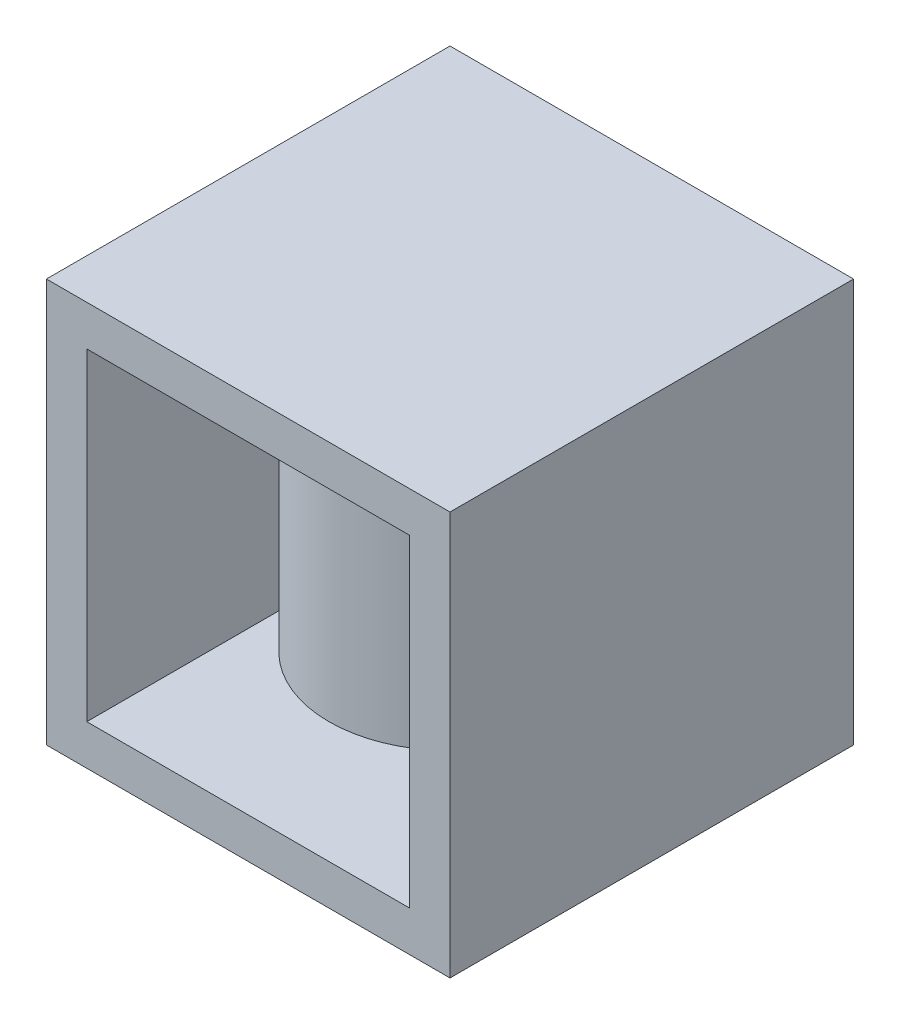
ISO-10303-21;
HEADER;
FILE_DESCRIPTION(('STEP AP214'),'2;1');
FILE_NAME('part.step','',(''),(''),'','','');
FILE_SCHEMA(('AUTOMOTIVE_DESIGN { 1 0 10303 214 1 1 1 1 }'));
ENDSEC;
DATA;
#1=APPLICATION_CONTEXT('core data for automotive mechanical design processes');
#2=APPLICATION_PROTOCOL_DEFINITION('international standard','automotive_design',2000,#1);
#3=PRODUCT_CONTEXT('',#1,'mechanical');
#4=PRODUCT('Part','Part','',(#3));
#5=PRODUCT_RELATED_PRODUCT_CATEGORY('part','',(#4));
#6=PRODUCT_DEFINITION_FORMATION('','',#4);
#7=PRODUCT_DEFINITION_CONTEXT('part definition',#1,'design');
#8=PRODUCT_DEFINITION('design','',#6,#7);
#9=PRODUCT_DEFINITION_SHAPE('','',#8);
#10=(LENGTH_UNIT() NAMED_UNIT(*) SI_UNIT(.MILLI.,.METRE.));
#11=(NAMED_UNIT(*) PLANE_ANGLE_UNIT() SI_UNIT($,.RADIAN.));
#12=(NAMED_UNIT(*) SI_UNIT($,.STERADIAN.) SOLID_ANGLE_UNIT());
#13=UNCERTAINTY_MEASURE_WITH_UNIT(LENGTH_MEASURE(1.E-05),#10,'distance_accuracy_value','');
#14=(GEOMETRIC_REPRESENTATION_CONTEXT(3) GLOBAL_UNCERTAINTY_ASSIGNED_CONTEXT((#13)) GLOBAL_UNIT_ASSIGNED_CONTEXT((#10,
#11,#12)) REPRESENTATION_CONTEXT('',''));
#15=CARTESIAN_POINT('',(0.,0.,0.));
#16=DIRECTION('',(0.,0.,1.));
#17=DIRECTION('',(1.,0.,0.));
#18=AXIS2_PLACEMENT_3D('',#15,#16,#17);
#19=CARTESIAN_POINT('',(0.,900.,1000.));
#20=DIRECTION('',(0.,1.,0.));
#21=DIRECTION('',(0.,0.,1.));
#22=AXIS2_PLACEMENT_3D('',#19,#20,#21);
#23=PLANE('',#22);
#24=CARTESIAN_POINT('',(500.,900.,500.));
#25=DIRECTION('',(0.,1.,0.));
#26=DIRECTION('',(0.,0.,1.));
#27=AXIS2_PLACEMENT_3D('',#24,#25,#26);
#28=CIRCLE('',#27,300.);
#29=CARTESIAN_POINT('',(500.,900.,800.));
#30=VERTEX_POINT('',#29);
#31=EDGE_CURVE('E11',#30,#30,#28,.F.);
#32=ORIENTED_EDGE('',*,*,#31,.F.);
#33=EDGE_LOOP('',(#32));
#34=FACE_BOUND('',#33,.T.);
#35=DIRECTION('',(1.,0.,0.));
#36=VECTOR('',#35,1.);
#37=CARTESIAN_POINT('',(0.,900.,0.));
#38=LINE('',#37,#36);
#39=CARTESIAN_POINT('',(100.,900.,0.));
#40=VERTEX_POINT('',#39);
#41=CARTESIAN_POINT('',(900.,900.,0.));
#42=VERTEX_POINT('',#41);
#43=EDGE_CURVE('E145',#40,#42,#38,.T.);
#44=ORIENTED_EDGE('',*,*,#43,.T.);
#45=DIRECTION('',(0.,0.,-1.));
#46=VECTOR('',#45,1.);
#47=CARTESIAN_POINT('',(900.,900.,1000.));
#48=LINE('',#47,#46);
#49=CARTESIAN_POINT('',(900.,900.,1000.));
#50=VERTEX_POINT('',#49);
#51=EDGE_CURVE('E44',#50,#42,#48,.T.);
#52=ORIENTED_EDGE('',*,*,#51,.F.);
#53=DIRECTION('',(1.,0.,0.));
#54=VECTOR('',#53,1.);
#55=CARTESIAN_POINT('',(0.,900.,1000.));
#56=LINE('',#55,#54);
#57=CARTESIAN_POINT('',(100.,900.,1000.));
#58=VERTEX_POINT('',#57);
#59=EDGE_CURVE('E113',#58,#50,#56,.T.);
#60=ORIENTED_EDGE('',*,*,#59,.F.);
#61=DIRECTION('',(0.,0.,-1.));
#62=VECTOR('',#61,1.);
#63=CARTESIAN_POINT('',(100.,900.,1000.));
#64=LINE('',#63,#62);
#65=EDGE_CURVE('E52',#58,#40,#64,.T.);
#66=ORIENTED_EDGE('',*,*,#65,.T.);
#67=EDGE_LOOP('',(#44,#52,#60,#66));
#68=FACE_BOUND('',#67,.T.);
#69=ADVANCED_FACE('F35',(#34,#68),#23,.F.);
#70=CARTESIAN_POINT('',(900.,-1.2490009027033E-13,1000.));
#71=DIRECTION('',(1.,0.,0.));
#72=DIRECTION('',(0.,1.,0.));
#73=AXIS2_PLACEMENT_3D('',#70,#71,#72);
#74=PLANE('',#73);
#75=DIRECTION('',(0.,-1.,0.));
#76=VECTOR('',#75,1.);
#77=CARTESIAN_POINT('',(900.,-1.2490009027033E-13,0.));
#78=LINE('',#77,#76);
#79=CARTESIAN_POINT('',(900.,100.,0.));
#80=VERTEX_POINT('',#79);
#81=EDGE_CURVE('E121',#42,#80,#78,.T.);
#82=ORIENTED_EDGE('',*,*,#81,.T.);
#83=DIRECTION('',(0.,0.,-1.));
#84=VECTOR('',#83,1.);
#85=CARTESIAN_POINT('',(900.,100.,1000.));
#86=LINE('',#85,#84);
#87=CARTESIAN_POINT('',(900.,100.,1000.));
#88=VERTEX_POINT('',#87);
#89=EDGE_CURVE('E119',#88,#80,#86,.T.);
#90=ORIENTED_EDGE('',*,*,#89,.F.);
#91=DIRECTION('',(0.,-1.,0.));
#92=VECTOR('',#91,1.);
#93=CARTESIAN_POINT('',(900.,-1.2490009027033E-13,1000.));
#94=LINE('',#93,#92);
#95=EDGE_CURVE('E107',#50,#88,#94,.T.);
#96=ORIENTED_EDGE('',*,*,#95,.F.);
#97=ORIENTED_EDGE('',*,*,#51,.T.);
#98=EDGE_LOOP('',(#82,#90,#96,#97));
#99=FACE_BOUND('',#98,.T.);
#100=ADVANCED_FACE('F120',(#99),#74,.F.);
#101=CARTESIAN_POINT('',(0.,100.,1000.));
#102=DIRECTION('',(0.,1.,0.));
#103=DIRECTION('',(0.,0.,1.));
#104=AXIS2_PLACEMENT_3D('',#101,#102,#103);
#105=PLANE('',#104);
#106=DIRECTION('',(1.,0.,0.));
#107=VECTOR('',#106,1.);
#108=CARTESIAN_POINT('',(0.,100.,0.));
#109=LINE('',#108,#107);
#110=CARTESIAN_POINT('',(100.,100.,0.));
#111=VERTEX_POINT('',#110);
#112=EDGE_CURVE('E148',#111,#80,#109,.T.);
#113=ORIENTED_EDGE('',*,*,#112,.F.);
#114=DIRECTION('',(0.,0.,-1.));
#115=VECTOR('',#114,1.);
#116=CARTESIAN_POINT('',(100.,100.,1000.));
#117=LINE('',#116,#115);
#118=CARTESIAN_POINT('',(100.,100.,1000.));
#119=VERTEX_POINT('',#118);
#120=EDGE_CURVE('E78',#119,#111,#117,.T.);
#121=ORIENTED_EDGE('',*,*,#120,.F.);
#122=DIRECTION('',(1.,0.,0.));
#123=VECTOR('',#122,1.);
#124=CARTESIAN_POINT('',(0.,100.,1000.));
#125=LINE('',#124,#123);
#126=EDGE_CURVE('E112',#119,#88,#125,.T.);
#127=ORIENTED_EDGE('',*,*,#126,.T.);
#128=ORIENTED_EDGE('',*,*,#89,.T.);
#129=EDGE_LOOP('',(#113,#121,#127,#128));
#130=FACE_BOUND('',#129,.T.);
#131=ADVANCED_FACE('F125',(#130),#105,.T.);
#132=CARTESIAN_POINT('',(0.,0.,1000.));
#133=DIRECTION('',(0.,1.,0.));
#134=DIRECTION('',(0.,0.,1.));
#135=AXIS2_PLACEMENT_3D('',#132,#133,#134);
#136=PLANE('',#135);
#137=DIRECTION('',(1.,0.,0.));
#138=VECTOR('',#137,1.);
#139=CARTESIAN_POINT('',(0.,0.,0.));
#140=LINE('',#139,#138);
#141=CARTESIAN_POINT('',(0.,0.,0.));
#142=VERTEX_POINT('',#141);
#143=CARTESIAN_POINT('',(1000.,0.,0.));
#144=VERTEX_POINT('',#143);
#145=EDGE_CURVE('E132',#142,#144,#140,.T.);
#146=ORIENTED_EDGE('',*,*,#145,.T.);
#147=DIRECTION('',(0.,0.,-1.));
#148=VECTOR('',#147,1.);
#149=CARTESIAN_POINT('',(1000.,0.,1000.));
#150=LINE('',#149,#148);
#151=CARTESIAN_POINT('',(1000.,0.,1000.));
#152=VERTEX_POINT('',#151);
#153=EDGE_CURVE('E155',#152,#144,#150,.T.);
#154=ORIENTED_EDGE('',*,*,#153,.F.);
#155=DIRECTION('',(1.,0.,0.));
#156=VECTOR('',#155,1.);
#157=CARTESIAN_POINT('',(0.,0.,1000.));
#158=LINE('',#157,#156);
#159=CARTESIAN_POINT('',(0.,0.,1000.));
#160=VERTEX_POINT('',#159);
#161=EDGE_CURVE('E153',#160,#152,#158,.T.);
#162=ORIENTED_EDGE('',*,*,#161,.F.);
#163=DIRECTION('',(0.,0.,-1.));
#164=VECTOR('',#163,1.);
#165=CARTESIAN_POINT('',(0.,0.,1000.));
#166=LINE('',#165,#164);
#167=EDGE_CURVE('E128',#160,#142,#166,.T.);
#168=ORIENTED_EDGE('',*,*,#167,.T.);
#169=EDGE_LOOP('',(#146,#154,#162,#168));
#170=FACE_BOUND('',#169,.T.);
#171=ADVANCED_FACE('F37',(#170),#136,.F.);
#172=CARTESIAN_POINT('',(1000.,0.,1000.));
#173=DIRECTION('',(-1.,0.,0.));
#174=DIRECTION('',(0.,0.,1.));
#175=AXIS2_PLACEMENT_3D('',#172,#173,#174);
#176=PLANE('',#175);
#177=DIRECTION('',(0.,1.,0.));
#178=VECTOR('',#177,1.);
#179=CARTESIAN_POINT('',(1000.,0.,0.));
#180=LINE('',#179,#178);
#181=CARTESIAN_POINT('',(1000.,1000.,0.));
#182=VERTEX_POINT('',#181);
#183=EDGE_CURVE('E135',#144,#182,#180,.T.);
#184=ORIENTED_EDGE('',*,*,#183,.T.);
#185=DIRECTION('',(0.,0.,-1.));
#186=VECTOR('',#185,1.);
#187=CARTESIAN_POINT('',(1000.,1000.,1000.));
#188=LINE('',#187,#186);
#189=CARTESIAN_POINT('',(1000.,1000.,1000.));
#190=VERTEX_POINT('',#189);
#191=EDGE_CURVE('E161',#190,#182,#188,.T.);
#192=ORIENTED_EDGE('',*,*,#191,.F.);
#193=DIRECTION('',(0.,1.,0.));
#194=VECTOR('',#193,1.);
#195=CARTESIAN_POINT('',(1000.,0.,1000.));
#196=LINE('',#195,#194);
#197=EDGE_CURVE('E91',#152,#190,#196,.T.);
#198=ORIENTED_EDGE('',*,*,#197,.F.);
#199=ORIENTED_EDGE('',*,*,#153,.T.);
#200=EDGE_LOOP('',(#184,#192,#198,#199));
#201=FACE_BOUND('',#200,.T.);
#202=ADVANCED_FACE('F163',(#201),#176,.F.);
#203=CARTESIAN_POINT('',(0.,1000.,1000.));
#204=DIRECTION('',(0.,1.,0.));
#205=DIRECTION('',(0.,0.,1.));
#206=AXIS2_PLACEMENT_3D('',#203,#204,#205);
#207=PLANE('',#206);
#208=DIRECTION('',(1.,0.,0.));
#209=VECTOR('',#208,1.);
#210=CARTESIAN_POINT('',(0.,1000.,0.));
#211=LINE('',#210,#209);
#212=CARTESIAN_POINT('',(0.,1000.,0.));
#213=VERTEX_POINT('',#212);
#214=EDGE_CURVE('E139',#213,#182,#211,.T.);
#215=ORIENTED_EDGE('',*,*,#214,.F.);
#216=DIRECTION('',(0.,0.,-1.));
#217=VECTOR('',#216,1.);
#218=CARTESIAN_POINT('',(0.,1000.,1000.));
#219=LINE('',#218,#217);
#220=CARTESIAN_POINT('',(0.,1000.,1000.));
#221=VERTEX_POINT('',#220);
#222=EDGE_CURVE('E159',#221,#213,#219,.T.);
#223=ORIENTED_EDGE('',*,*,#222,.F.);
#224=DIRECTION('',(1.,0.,0.));
#225=VECTOR('',#224,1.);
#226=CARTESIAN_POINT('',(0.,1000.,1000.));
#227=LINE('',#226,#225);
#228=EDGE_CURVE('E181',#221,#190,#227,.T.);
#229=ORIENTED_EDGE('',*,*,#228,.T.);
#230=ORIENTED_EDGE('',*,*,#191,.T.);
#231=EDGE_LOOP('',(#215,#223,#229,#230));
#232=FACE_BOUND('',#231,.T.);
#233=ADVANCED_FACE('F180',(#232),#207,.T.);
#234=CARTESIAN_POINT('',(0.,0.,1000.));
#235=DIRECTION('',(-1.,0.,0.));
#236=DIRECTION('',(0.,0.,1.));
#237=AXIS2_PLACEMENT_3D('',#234,#235,#236);
#238=PLANE('',#237);
#239=DIRECTION('',(0.,1.,0.));
#240=VECTOR('',#239,1.);
#241=CARTESIAN_POINT('',(0.,0.,0.));
#242=LINE('',#241,#240);
#243=EDGE_CURVE('E142',#142,#213,#242,.T.);
#244=ORIENTED_EDGE('',*,*,#243,.F.);
#245=ORIENTED_EDGE('',*,*,#167,.F.);
#246=DIRECTION('',(0.,1.,0.));
#247=VECTOR('',#246,1.);
#248=CARTESIAN_POINT('',(0.,0.,1000.));
#249=LINE('',#248,#247);
#250=EDGE_CURVE('E176',#160,#221,#249,.T.);
#251=ORIENTED_EDGE('',*,*,#250,.T.);
#252=ORIENTED_EDGE('',*,*,#222,.T.);
#253=EDGE_LOOP('',(#244,#245,#251,#252));
#254=FACE_BOUND('',#253,.T.);
#255=ADVANCED_FACE('F172',(#254),#238,.T.);
#256=CARTESIAN_POINT('',(100.,0.,1000.));
#257=DIRECTION('',(1.,0.,0.));
#258=DIRECTION('',(0.,1.,0.));
#259=AXIS2_PLACEMENT_3D('',#256,#257,#258);
#260=PLANE('',#259);
#261=DIRECTION('',(0.,-1.,0.));
#262=VECTOR('',#261,1.);
#263=CARTESIAN_POINT('',(100.,0.,0.));
#264=LINE('',#263,#262);
#265=EDGE_CURVE('E150',#40,#111,#264,.T.);
#266=ORIENTED_EDGE('',*,*,#265,.F.);
#267=ORIENTED_EDGE('',*,*,#65,.F.);
#268=DIRECTION('',(0.,-1.,0.));
#269=VECTOR('',#268,1.);
#270=CARTESIAN_POINT('',(100.,0.,1000.));
#271=LINE('',#270,#269);
#272=EDGE_CURVE('E126',#58,#119,#271,.T.);
#273=ORIENTED_EDGE('',*,*,#272,.T.);
#274=ORIENTED_EDGE('',*,*,#120,.T.);
#275=EDGE_LOOP('',(#266,#267,#273,#274));
#276=FACE_BOUND('',#275,.T.);
#277=ADVANCED_FACE('F201',(#276),#260,.T.);
#278=CARTESIAN_POINT('',(0.,0.,1000.));
#279=DIRECTION('',(0.,0.,1.));
#280=DIRECTION('',(1.,0.,0.));
#281=AXIS2_PLACEMENT_3D('',#278,#279,#280);
#282=PLANE('',#281);
#283=ORIENTED_EDGE('',*,*,#161,.T.);
#284=ORIENTED_EDGE('',*,*,#197,.T.);
#285=ORIENTED_EDGE('',*,*,#228,.F.);
#286=ORIENTED_EDGE('',*,*,#250,.F.);
#287=EDGE_LOOP('',(#283,#284,#285,#286));
#288=FACE_BOUND('',#287,.T.);
#289=ORIENTED_EDGE('',*,*,#59,.T.);
#290=ORIENTED_EDGE('',*,*,#95,.T.);
#291=ORIENTED_EDGE('',*,*,#126,.F.);
#292=ORIENTED_EDGE('',*,*,#272,.F.);
#293=EDGE_LOOP('',(#289,#290,#291,#292));
#294=FACE_BOUND('',#293,.T.);
#295=ADVANCED_FACE('F109',(#288,#294),#282,.T.);
#296=CARTESIAN_POINT('',(0.,0.,0.));
#297=DIRECTION('',(0.,0.,1.));
#298=DIRECTION('',(1.,0.,0.));
#299=AXIS2_PLACEMENT_3D('',#296,#297,#298);
#300=PLANE('',#299);
#301=ORIENTED_EDGE('',*,*,#145,.F.);
#302=ORIENTED_EDGE('',*,*,#243,.T.);
#303=ORIENTED_EDGE('',*,*,#214,.T.);
#304=ORIENTED_EDGE('',*,*,#183,.F.);
#305=EDGE_LOOP('',(#301,#302,#303,#304));
#306=FACE_BOUND('',#305,.T.);
#307=ORIENTED_EDGE('',*,*,#43,.F.);
#308=ORIENTED_EDGE('',*,*,#265,.T.);
#309=ORIENTED_EDGE('',*,*,#112,.T.);
#310=ORIENTED_EDGE('',*,*,#81,.F.);
#311=EDGE_LOOP('',(#307,#308,#309,#310));
#312=FACE_BOUND('',#311,.T.);
#313=ADVANCED_FACE('F169',(#306,#312),#300,.F.);
#314=CARTESIAN_POINT('',(500.,200.,500.));
#315=DIRECTION('',(0.,1.,0.));
#316=DIRECTION('',(0.,0.,1.));
#317=AXIS2_PLACEMENT_3D('',#314,#315,#316);
#318=CYLINDRICAL_SURFACE('',#317,300.);
#319=CARTESIAN_POINT('',(500.,200.,500.));
#320=DIRECTION('',(0.,-1.,0.));
#321=DIRECTION('',(0.,0.,-1.));
#322=AXIS2_PLACEMENT_3D('',#319,#320,#321);
#323=CIRCLE('',#322,300.);
#324=CARTESIAN_POINT('',(500.,200.,200.));
#325=VERTEX_POINT('',#324);
#326=EDGE_CURVE('E136',#325,#325,#323,.T.);
#327=ORIENTED_EDGE('',*,*,#326,.F.);
#328=EDGE_LOOP('',(#327));
#329=FACE_BOUND('',#328,.T.);
#330=ORIENTED_EDGE('',*,*,#31,.T.);
#331=EDGE_LOOP('',(#330));
#332=FACE_BOUND('',#331,.T.);
#333=ADVANCED_FACE('F193',(#329,#332),#318,.T.);
#334=CARTESIAN_POINT('',(500.,200.,500.));
#335=DIRECTION('',(0.,-1.,0.));
#336=DIRECTION('',(0.,0.,-1.));
#337=AXIS2_PLACEMENT_3D('',#334,#335,#336);
#338=PLANE('',#337);
#339=ORIENTED_EDGE('',*,*,#326,.T.);
#340=EDGE_LOOP('',(#339));
#341=FACE_BOUND('',#340,.T.);
#342=ADVANCED_FACE('F191',(#341),#338,.T.);
#343=CLOSED_SHELL('',(#69,#100,#131,#171,#202,#233,#255,#277,#295,#313,#333,#342));
#344=MANIFOLD_SOLID_BREP('B2',#343);
#345=ADVANCED_BREP_SHAPE_REPRESENTATION('',(#18,#344),#14);
#346=SHAPE_DEFINITION_REPRESENTATION(#9,#345);
ENDSEC;
END-ISO-10303-21;
